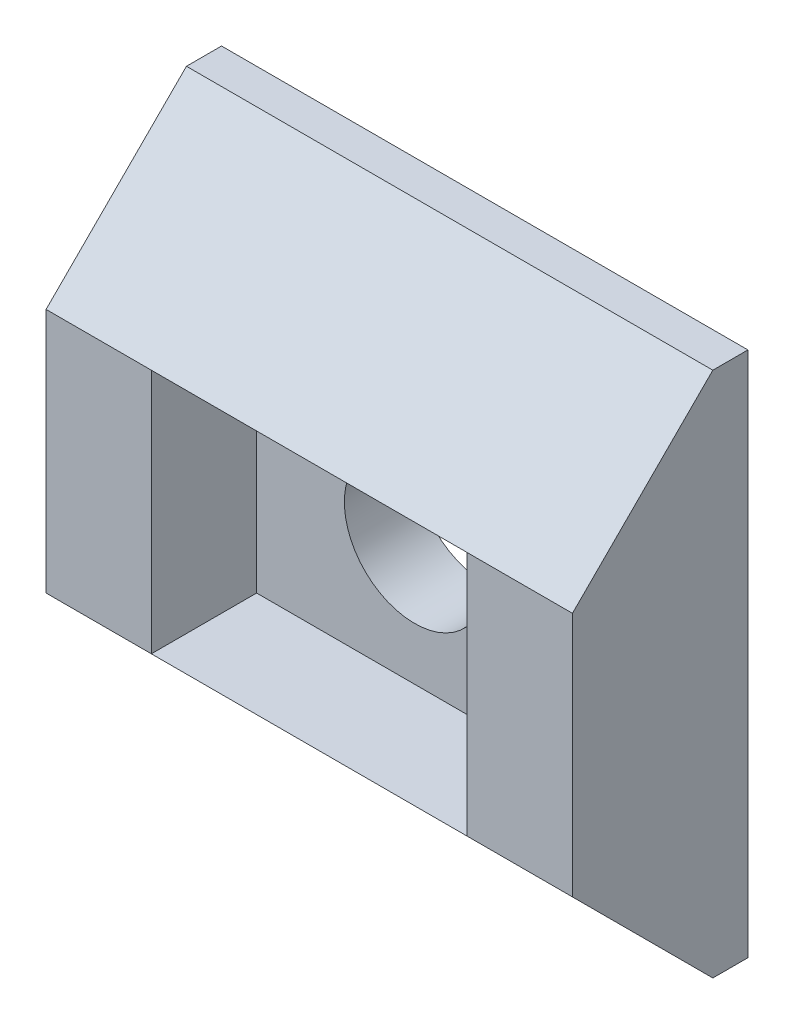
ISO-10303-21;
HEADER;
FILE_DESCRIPTION(('STEP AP214'),'2;1');
FILE_NAME('part.step','',(''),(''),'','','');
FILE_SCHEMA(('AUTOMOTIVE_DESIGN { 1 0 10303 214 1 1 1 1 }'));
ENDSEC;
DATA;
#1=APPLICATION_CONTEXT('core data for automotive mechanical design processes');
#2=APPLICATION_PROTOCOL_DEFINITION('international standard','automotive_design',2000,#1);
#3=PRODUCT_CONTEXT('',#1,'mechanical');
#4=PRODUCT('Part','Part','',(#3));
#5=PRODUCT_RELATED_PRODUCT_CATEGORY('part','',(#4));
#6=PRODUCT_DEFINITION_FORMATION('','',#4);
#7=PRODUCT_DEFINITION_CONTEXT('part definition',#1,'design');
#8=PRODUCT_DEFINITION('design','',#6,#7);
#9=PRODUCT_DEFINITION_SHAPE('','',#8);
#10=(LENGTH_UNIT() NAMED_UNIT(*) SI_UNIT(.MILLI.,.METRE.));
#11=(NAMED_UNIT(*) PLANE_ANGLE_UNIT() SI_UNIT($,.RADIAN.));
#12=(NAMED_UNIT(*) SI_UNIT($,.STERADIAN.) SOLID_ANGLE_UNIT());
#13=UNCERTAINTY_MEASURE_WITH_UNIT(LENGTH_MEASURE(1.E-05),#10,'distance_accuracy_value','');
#14=(GEOMETRIC_REPRESENTATION_CONTEXT(3) GLOBAL_UNCERTAINTY_ASSIGNED_CONTEXT((#13)) GLOBAL_UNIT_ASSIGNED_CONTEXT((#10,
#11,#12)) REPRESENTATION_CONTEXT('',''));
#15=CARTESIAN_POINT('',(0.,0.,0.));
#16=DIRECTION('',(0.,0.,1.));
#17=DIRECTION('',(1.,0.,0.));
#18=AXIS2_PLACEMENT_3D('',#15,#16,#17);
#19=CARTESIAN_POINT('',(0.,0.,5.));
#20=DIRECTION('',(0.,0.,-1.));
#21=DIRECTION('',(-1.,0.,0.));
#22=AXIS2_PLACEMENT_3D('',#19,#20,#21);
#23=PLANE('',#22);
#24=DIRECTION('',(-1.,0.,0.));
#25=VECTOR('',#24,1.);
#26=CARTESIAN_POINT('',(7.5,3.5,5.));
#27=LINE('',#26,#25);
#28=CARTESIAN_POINT('',(7.5,3.5,5.));
#29=VERTEX_POINT('',#28);
#30=CARTESIAN_POINT('',(4.5,3.5,5.));
#31=VERTEX_POINT('',#30);
#32=EDGE_CURVE('E163',#29,#31,#27,.T.);
#33=ORIENTED_EDGE('',*,*,#32,.T.);
#34=DIRECTION('',(0.,1.,0.));
#35=VECTOR('',#34,1.);
#36=CARTESIAN_POINT('',(4.5,3.5,5.));
#37=LINE('',#36,#35);
#38=CARTESIAN_POINT('',(4.5,-3.5,5.));
#39=VERTEX_POINT('',#38);
#40=EDGE_CURVE('E50',#39,#31,#37,.T.);
#41=ORIENTED_EDGE('',*,*,#40,.F.);
#42=DIRECTION('',(-1.,0.,0.));
#43=VECTOR('',#42,1.);
#44=CARTESIAN_POINT('',(7.5,-3.5,5.));
#45=LINE('',#44,#43);
#46=CARTESIAN_POINT('',(7.5,-3.5,5.));
#47=VERTEX_POINT('',#46);
#48=EDGE_CURVE('E175',#47,#39,#45,.T.);
#49=ORIENTED_EDGE('',*,*,#48,.F.);
#50=DIRECTION('',(0.,1.,0.));
#51=VECTOR('',#50,1.);
#52=CARTESIAN_POINT('',(7.5,-7.5,5.));
#53=LINE('',#52,#51);
#54=EDGE_CURVE('E178',#47,#29,#53,.T.);
#55=ORIENTED_EDGE('',*,*,#54,.T.);
#56=EDGE_LOOP('',(#33,#41,#49,#55));
#57=FACE_BOUND('',#56,.T.);
#58=ADVANCED_FACE('F34',(#57),#23,.F.);
#59=CARTESIAN_POINT('',(0.,0.,0.));
#60=DIRECTION('',(0.,0.,1.));
#61=DIRECTION('',(1.,0.,0.));
#62=AXIS2_PLACEMENT_3D('',#59,#60,#61);
#63=CYLINDRICAL_SURFACE('',#62,2.);
#64=CARTESIAN_POINT('',(0.,0.,0.));
#65=DIRECTION('',(0.,0.,1.));
#66=DIRECTION('',(1.,0.,0.));
#67=AXIS2_PLACEMENT_3D('',#64,#65,#66);
#68=CIRCLE('',#67,2.);
#69=CARTESIAN_POINT('',(2.,0.,0.));
#70=VERTEX_POINT('',#69);
#71=EDGE_CURVE('E152',#70,#70,#68,.T.);
#72=ORIENTED_EDGE('',*,*,#71,.F.);
#73=EDGE_LOOP('',(#72));
#74=FACE_BOUND('',#73,.T.);
#75=CARTESIAN_POINT('',(0.,0.,2.));
#76=DIRECTION('',(0.,0.,1.));
#77=DIRECTION('',(1.,0.,0.));
#78=AXIS2_PLACEMENT_3D('',#75,#76,#77);
#79=CIRCLE('',#78,2.);
#80=CARTESIAN_POINT('',(2.,0.,2.));
#81=VERTEX_POINT('',#80);
#82=EDGE_CURVE('E38',#81,#81,#79,.F.);
#83=ORIENTED_EDGE('',*,*,#82,.F.);
#84=EDGE_LOOP('',(#83));
#85=FACE_BOUND('',#84,.T.);
#86=ADVANCED_FACE('F232',(#74,#85),#63,.F.);
#87=CARTESIAN_POINT('',(7.5,-7.5,5.));
#88=DIRECTION('',(-1.,0.,0.));
#89=DIRECTION('',(0.,0.,1.));
#90=AXIS2_PLACEMENT_3D('',#87,#88,#89);
#91=PLANE('',#90);
#92=DIRECTION('',(0.,0.,-1.));
#93=VECTOR('',#92,1.);
#94=CARTESIAN_POINT('',(7.5,7.5,5.));
#95=LINE('',#94,#93);
#96=CARTESIAN_POINT('',(7.5,7.5,1.));
#97=VERTEX_POINT('',#96);
#98=CARTESIAN_POINT('',(7.5,7.5,0.));
#99=VERTEX_POINT('',#98);
#100=EDGE_CURVE('E11',#97,#99,#95,.T.);
#101=ORIENTED_EDGE('',*,*,#100,.F.);
#102=DIRECTION('',(0.,-0.707106781186548,0.707106781186548));
#103=VECTOR('',#102,1.);
#104=CARTESIAN_POINT('',(7.5,7.5,1.));
#105=LINE('',#104,#103);
#106=EDGE_CURVE('E156',#97,#29,#105,.T.);
#107=ORIENTED_EDGE('',*,*,#106,.T.);
#108=ORIENTED_EDGE('',*,*,#54,.F.);
#109=DIRECTION('',(0.,-0.707106781186548,-0.707106781186548));
#110=VECTOR('',#109,1.);
#111=CARTESIAN_POINT('',(7.5,-7.5,1.));
#112=LINE('',#111,#110);
#113=CARTESIAN_POINT('',(7.5,-7.5,1.));
#114=VERTEX_POINT('',#113);
#115=EDGE_CURVE('E168',#47,#114,#112,.T.);
#116=ORIENTED_EDGE('',*,*,#115,.T.);
#117=DIRECTION('',(0.,0.,-1.));
#118=VECTOR('',#117,1.);
#119=CARTESIAN_POINT('',(7.5,-7.5,5.));
#120=LINE('',#119,#118);
#121=CARTESIAN_POINT('',(7.5,-7.5,0.));
#122=VERTEX_POINT('',#121);
#123=EDGE_CURVE('E184',#114,#122,#120,.T.);
#124=ORIENTED_EDGE('',*,*,#123,.T.);
#125=DIRECTION('',(0.,1.,0.));
#126=VECTOR('',#125,1.);
#127=CARTESIAN_POINT('',(7.5,-7.5,0.));
#128=LINE('',#127,#126);
#129=EDGE_CURVE('E166',#122,#99,#128,.T.);
#130=ORIENTED_EDGE('',*,*,#129,.T.);
#131=EDGE_LOOP('',(#101,#107,#108,#116,#124,#130));
#132=FACE_BOUND('',#131,.T.);
#133=ADVANCED_FACE('F36',(#132),#91,.F.);
#134=CARTESIAN_POINT('',(-7.5,7.5,5.));
#135=DIRECTION('',(0.,-1.,0.));
#136=DIRECTION('',(0.,0.,-1.));
#137=AXIS2_PLACEMENT_3D('',#134,#135,#136);
#138=PLANE('',#137);
#139=DIRECTION('',(0.,0.,-1.));
#140=VECTOR('',#139,1.);
#141=CARTESIAN_POINT('',(-7.5,7.5,5.));
#142=LINE('',#141,#140);
#143=CARTESIAN_POINT('',(-7.5,7.5,1.));
#144=VERTEX_POINT('',#143);
#145=CARTESIAN_POINT('',(-7.5,7.5,0.));
#146=VERTEX_POINT('',#145);
#147=EDGE_CURVE('E43',#144,#146,#142,.T.);
#148=ORIENTED_EDGE('',*,*,#147,.F.);
#149=DIRECTION('',(-1.,0.,0.));
#150=VECTOR('',#149,1.);
#151=CARTESIAN_POINT('',(7.5,7.5,1.));
#152=LINE('',#151,#150);
#153=EDGE_CURVE('E159',#97,#144,#152,.T.);
#154=ORIENTED_EDGE('',*,*,#153,.F.);
#155=ORIENTED_EDGE('',*,*,#100,.T.);
#156=DIRECTION('',(-1.,0.,0.));
#157=VECTOR('',#156,1.);
#158=CARTESIAN_POINT('',(-7.5,7.5,0.));
#159=LINE('',#158,#157);
#160=EDGE_CURVE('E187',#99,#146,#159,.T.);
#161=ORIENTED_EDGE('',*,*,#160,.T.);
#162=EDGE_LOOP('',(#148,#154,#155,#161));
#163=FACE_BOUND('',#162,.T.);
#164=ADVANCED_FACE('F209',(#163),#138,.F.);
#165=CARTESIAN_POINT('',(-7.5,-7.5,5.));
#166=DIRECTION('',(1.,0.,0.));
#167=DIRECTION('',(0.,0.,-1.));
#168=AXIS2_PLACEMENT_3D('',#165,#166,#167);
#169=PLANE('',#168);
#170=DIRECTION('',(0.,-1.,0.));
#171=VECTOR('',#170,1.);
#172=CARTESIAN_POINT('',(-7.5,-7.5,5.));
#173=LINE('',#172,#171);
#174=CARTESIAN_POINT('',(-7.5,3.5,5.));
#175=VERTEX_POINT('',#174);
#176=CARTESIAN_POINT('',(-7.5,-3.5,5.));
#177=VERTEX_POINT('',#176);
#178=EDGE_CURVE('E181',#175,#177,#173,.T.);
#179=ORIENTED_EDGE('',*,*,#178,.F.);
#180=DIRECTION('',(0.,-0.707106781186548,0.707106781186548));
#181=VECTOR('',#180,1.);
#182=CARTESIAN_POINT('',(-7.5,7.5,1.));
#183=LINE('',#182,#181);
#184=EDGE_CURVE('E160',#144,#175,#183,.T.);
#185=ORIENTED_EDGE('',*,*,#184,.F.);
#186=ORIENTED_EDGE('',*,*,#147,.T.);
#187=DIRECTION('',(0.,-1.,0.));
#188=VECTOR('',#187,1.);
#189=CARTESIAN_POINT('',(-7.5,-7.5,0.));
#190=LINE('',#189,#188);
#191=CARTESIAN_POINT('',(-7.5,-7.5,0.));
#192=VERTEX_POINT('',#191);
#193=EDGE_CURVE('E190',#146,#192,#190,.T.);
#194=ORIENTED_EDGE('',*,*,#193,.T.);
#195=DIRECTION('',(0.,0.,-1.));
#196=VECTOR('',#195,1.);
#197=CARTESIAN_POINT('',(-7.5,-7.5,5.));
#198=LINE('',#197,#196);
#199=CARTESIAN_POINT('',(-7.5,-7.5,1.));
#200=VERTEX_POINT('',#199);
#201=EDGE_CURVE('E196',#200,#192,#198,.T.);
#202=ORIENTED_EDGE('',*,*,#201,.F.);
#203=DIRECTION('',(0.,-0.707106781186548,-0.707106781186548));
#204=VECTOR('',#203,1.);
#205=CARTESIAN_POINT('',(-7.5,-7.5,1.));
#206=LINE('',#205,#204);
#207=EDGE_CURVE('E155',#177,#200,#206,.T.);
#208=ORIENTED_EDGE('',*,*,#207,.F.);
#209=EDGE_LOOP('',(#179,#185,#186,#194,#202,#208));
#210=FACE_BOUND('',#209,.T.);
#211=ADVANCED_FACE('F202',(#210),#169,.F.);
#212=CARTESIAN_POINT('',(-7.5,-7.5,5.));
#213=DIRECTION('',(0.,1.,0.));
#214=DIRECTION('',(0.,0.,1.));
#215=AXIS2_PLACEMENT_3D('',#212,#213,#214);
#216=PLANE('',#215);
#217=ORIENTED_EDGE('',*,*,#123,.F.);
#218=DIRECTION('',(-1.,0.,0.));
#219=VECTOR('',#218,1.);
#220=CARTESIAN_POINT('',(7.5,-7.5,1.));
#221=LINE('',#220,#219);
#222=EDGE_CURVE('E162',#114,#200,#221,.T.);
#223=ORIENTED_EDGE('',*,*,#222,.T.);
#224=ORIENTED_EDGE('',*,*,#201,.T.);
#225=DIRECTION('',(1.,0.,0.));
#226=VECTOR('',#225,1.);
#227=CARTESIAN_POINT('',(-7.5,-7.5,0.));
#228=LINE('',#227,#226);
#229=EDGE_CURVE('E182',#192,#122,#228,.T.);
#230=ORIENTED_EDGE('',*,*,#229,.T.);
#231=EDGE_LOOP('',(#217,#223,#224,#230));
#232=FACE_BOUND('',#231,.T.);
#233=ADVANCED_FACE('F216',(#232),#216,.F.);
#234=CARTESIAN_POINT('',(-4.5,-3.5,5.));
#235=VERTEX_POINT('',#234);
#236=EDGE_CURVE('E171',#235,#177,#45,.T.);
#237=ORIENTED_EDGE('',*,*,#236,.F.);
#238=DIRECTION('',(0.,-1.,0.));
#239=VECTOR('',#238,1.);
#240=CARTESIAN_POINT('',(-4.5,3.5,5.));
#241=LINE('',#240,#239);
#242=CARTESIAN_POINT('',(-4.5,3.5,5.));
#243=VERTEX_POINT('',#242);
#244=EDGE_CURVE('E137',#243,#235,#241,.T.);
#245=ORIENTED_EDGE('',*,*,#244,.F.);
#246=EDGE_CURVE('E58',#243,#175,#27,.T.);
#247=ORIENTED_EDGE('',*,*,#246,.T.);
#248=ORIENTED_EDGE('',*,*,#178,.T.);
#249=EDGE_LOOP('',(#237,#245,#247,#248));
#250=FACE_BOUND('',#249,.T.);
#251=ADVANCED_FACE('F220',(#250),#23,.F.);
#252=CARTESIAN_POINT('',(0.,0.,0.));
#253=DIRECTION('',(0.,0.,-1.));
#254=DIRECTION('',(-1.,0.,0.));
#255=AXIS2_PLACEMENT_3D('',#252,#253,#254);
#256=PLANE('',#255);
#257=ORIENTED_EDGE('',*,*,#71,.T.);
#258=EDGE_LOOP('',(#257));
#259=FACE_BOUND('',#258,.T.);
#260=ORIENTED_EDGE('',*,*,#129,.F.);
#261=ORIENTED_EDGE('',*,*,#229,.F.);
#262=ORIENTED_EDGE('',*,*,#193,.F.);
#263=ORIENTED_EDGE('',*,*,#160,.F.);
#264=EDGE_LOOP('',(#260,#261,#262,#263));
#265=FACE_BOUND('',#264,.T.);
#266=ADVANCED_FACE('F213',(#259,#265),#256,.T.);
#267=CARTESIAN_POINT('',(7.5,-7.5,1.));
#268=DIRECTION('',(0.,0.707106781186547,-0.707106781186547));
#269=DIRECTION('',(0.,0.707106781186548,0.707106781186548));
#270=AXIS2_PLACEMENT_3D('',#267,#268,#269);
#271=PLANE('',#270);
#272=ORIENTED_EDGE('',*,*,#207,.T.);
#273=ORIENTED_EDGE('',*,*,#222,.F.);
#274=ORIENTED_EDGE('',*,*,#115,.F.);
#275=ORIENTED_EDGE('',*,*,#48,.T.);
#276=DIRECTION('',(1.,0.,0.));
#277=VECTOR('',#276,1.);
#278=CARTESIAN_POINT('',(-4.5,-3.5,5.));
#279=LINE('',#278,#277);
#280=EDGE_CURVE('E134',#235,#39,#279,.T.);
#281=ORIENTED_EDGE('',*,*,#280,.F.);
#282=ORIENTED_EDGE('',*,*,#236,.T.);
#283=EDGE_LOOP('',(#272,#273,#274,#275,#281,#282));
#284=FACE_BOUND('',#283,.T.);
#285=ADVANCED_FACE('F222',(#284),#271,.F.);
#286=CARTESIAN_POINT('',(7.5,7.5,1.));
#287=DIRECTION('',(0.,-0.707106781186547,-0.707106781186547));
#288=DIRECTION('',(0.,0.707106781186548,-0.707106781186548));
#289=AXIS2_PLACEMENT_3D('',#286,#287,#288);
#290=PLANE('',#289);
#291=ORIENTED_EDGE('',*,*,#184,.T.);
#292=ORIENTED_EDGE('',*,*,#246,.F.);
#293=DIRECTION('',(-1.,0.,0.));
#294=VECTOR('',#293,1.);
#295=CARTESIAN_POINT('',(-4.5,3.5,5.));
#296=LINE('',#295,#294);
#297=EDGE_CURVE('E143',#31,#243,#296,.T.);
#298=ORIENTED_EDGE('',*,*,#297,.F.);
#299=ORIENTED_EDGE('',*,*,#32,.F.);
#300=ORIENTED_EDGE('',*,*,#106,.F.);
#301=ORIENTED_EDGE('',*,*,#153,.T.);
#302=EDGE_LOOP('',(#291,#292,#298,#299,#300,#301));
#303=FACE_BOUND('',#302,.T.);
#304=ADVANCED_FACE('F229',(#303),#290,.F.);
#305=CARTESIAN_POINT('',(0.,0.,2.));
#306=DIRECTION('',(0.,0.,1.));
#307=DIRECTION('',(1.,0.,0.));
#308=AXIS2_PLACEMENT_3D('',#305,#306,#307);
#309=PLANE('',#308);
#310=DIRECTION('',(0.,1.,0.));
#311=VECTOR('',#310,1.);
#312=CARTESIAN_POINT('',(4.5,3.5,2.));
#313=LINE('',#312,#311);
#314=CARTESIAN_POINT('',(4.5,-3.5,2.));
#315=VERTEX_POINT('',#314);
#316=CARTESIAN_POINT('',(4.5,3.5,2.));
#317=VERTEX_POINT('',#316);
#318=EDGE_CURVE('E115',#315,#317,#313,.T.);
#319=ORIENTED_EDGE('',*,*,#318,.T.);
#320=DIRECTION('',(-1.,0.,0.));
#321=VECTOR('',#320,1.);
#322=CARTESIAN_POINT('',(-4.5,3.5,2.));
#323=LINE('',#322,#321);
#324=CARTESIAN_POINT('',(-4.5,3.5,2.));
#325=VERTEX_POINT('',#324);
#326=EDGE_CURVE('E124',#317,#325,#323,.T.);
#327=ORIENTED_EDGE('',*,*,#326,.T.);
#328=DIRECTION('',(0.,-1.,0.));
#329=VECTOR('',#328,1.);
#330=CARTESIAN_POINT('',(-4.5,3.5,2.));
#331=LINE('',#330,#329);
#332=CARTESIAN_POINT('',(-4.5,-3.5,2.));
#333=VERTEX_POINT('',#332);
#334=EDGE_CURVE('E129',#325,#333,#331,.T.);
#335=ORIENTED_EDGE('',*,*,#334,.T.);
#336=DIRECTION('',(1.,0.,0.));
#337=VECTOR('',#336,1.);
#338=CARTESIAN_POINT('',(-4.5,-3.5,2.));
#339=LINE('',#338,#337);
#340=EDGE_CURVE('E121',#333,#315,#339,.T.);
#341=ORIENTED_EDGE('',*,*,#340,.T.);
#342=EDGE_LOOP('',(#319,#327,#335,#341));
#343=FACE_BOUND('',#342,.T.);
#344=ORIENTED_EDGE('',*,*,#82,.T.);
#345=EDGE_LOOP('',(#344));
#346=FACE_BOUND('',#345,.T.);
#347=ADVANCED_FACE('F131',(#343,#346),#309,.T.);
#348=CARTESIAN_POINT('',(4.5,3.5,2.));
#349=DIRECTION('',(1.,0.,0.));
#350=DIRECTION('',(0.,1.,0.));
#351=AXIS2_PLACEMENT_3D('',#348,#349,#350);
#352=PLANE('',#351);
#353=ORIENTED_EDGE('',*,*,#40,.T.);
#354=DIRECTION('',(0.,0.,1.));
#355=VECTOR('',#354,1.);
#356=CARTESIAN_POINT('',(4.5,3.5,2.));
#357=LINE('',#356,#355);
#358=EDGE_CURVE('E111',#317,#31,#357,.T.);
#359=ORIENTED_EDGE('',*,*,#358,.F.);
#360=ORIENTED_EDGE('',*,*,#318,.F.);
#361=DIRECTION('',(0.,0.,1.));
#362=VECTOR('',#361,1.);
#363=CARTESIAN_POINT('',(4.5,-3.5,2.));
#364=LINE('',#363,#362);
#365=EDGE_CURVE('E147',#315,#39,#364,.T.);
#366=ORIENTED_EDGE('',*,*,#365,.T.);
#367=EDGE_LOOP('',(#353,#359,#360,#366));
#368=FACE_BOUND('',#367,.T.);
#369=ADVANCED_FACE('F113',(#368),#352,.F.);
#370=CARTESIAN_POINT('',(-4.5,-3.5,2.));
#371=DIRECTION('',(0.,-1.,0.));
#372=DIRECTION('',(0.,0.,-1.));
#373=AXIS2_PLACEMENT_3D('',#370,#371,#372);
#374=PLANE('',#373);
#375=ORIENTED_EDGE('',*,*,#280,.T.);
#376=ORIENTED_EDGE('',*,*,#365,.F.);
#377=ORIENTED_EDGE('',*,*,#340,.F.);
#378=DIRECTION('',(0.,0.,1.));
#379=VECTOR('',#378,1.);
#380=CARTESIAN_POINT('',(-4.5,-3.5,2.));
#381=LINE('',#380,#379);
#382=EDGE_CURVE('E149',#333,#235,#381,.T.);
#383=ORIENTED_EDGE('',*,*,#382,.T.);
#384=EDGE_LOOP('',(#375,#376,#377,#383));
#385=FACE_BOUND('',#384,.T.);
#386=ADVANCED_FACE('F225',(#385),#374,.F.);
#387=CARTESIAN_POINT('',(-4.5,3.5,2.));
#388=DIRECTION('',(-1.,0.,0.));
#389=DIRECTION('',(0.,-1.,0.));
#390=AXIS2_PLACEMENT_3D('',#387,#388,#389);
#391=PLANE('',#390);
#392=ORIENTED_EDGE('',*,*,#244,.T.);
#393=ORIENTED_EDGE('',*,*,#382,.F.);
#394=ORIENTED_EDGE('',*,*,#334,.F.);
#395=DIRECTION('',(0.,0.,1.));
#396=VECTOR('',#395,1.);
#397=CARTESIAN_POINT('',(-4.5,3.5,2.));
#398=LINE('',#397,#396);
#399=EDGE_CURVE('E120',#325,#243,#398,.T.);
#400=ORIENTED_EDGE('',*,*,#399,.T.);
#401=EDGE_LOOP('',(#392,#393,#394,#400));
#402=FACE_BOUND('',#401,.T.);
#403=ADVANCED_FACE('F327',(#402),#391,.F.);
#404=CARTESIAN_POINT('',(-4.5,3.5,2.));
#405=DIRECTION('',(0.,1.,0.));
#406=DIRECTION('',(0.,0.,1.));
#407=AXIS2_PLACEMENT_3D('',#404,#405,#406);
#408=PLANE('',#407);
#409=ORIENTED_EDGE('',*,*,#297,.T.);
#410=ORIENTED_EDGE('',*,*,#399,.F.);
#411=ORIENTED_EDGE('',*,*,#326,.F.);
#412=ORIENTED_EDGE('',*,*,#358,.T.);
#413=EDGE_LOOP('',(#409,#410,#411,#412));
#414=FACE_BOUND('',#413,.T.);
#415=ADVANCED_FACE('F125',(#414),#408,.F.);
#416=CLOSED_SHELL('',(#58,#86,#133,#164,#211,#233,#251,#266,#285,#304,#347,#369,#386,#403,#415));
#417=MANIFOLD_SOLID_BREP('B2',#416);
#418=ADVANCED_BREP_SHAPE_REPRESENTATION('',(#18,#417),#14);
#419=SHAPE_DEFINITION_REPRESENTATION(#9,#418);
ENDSEC;
END-ISO-10303-21;
